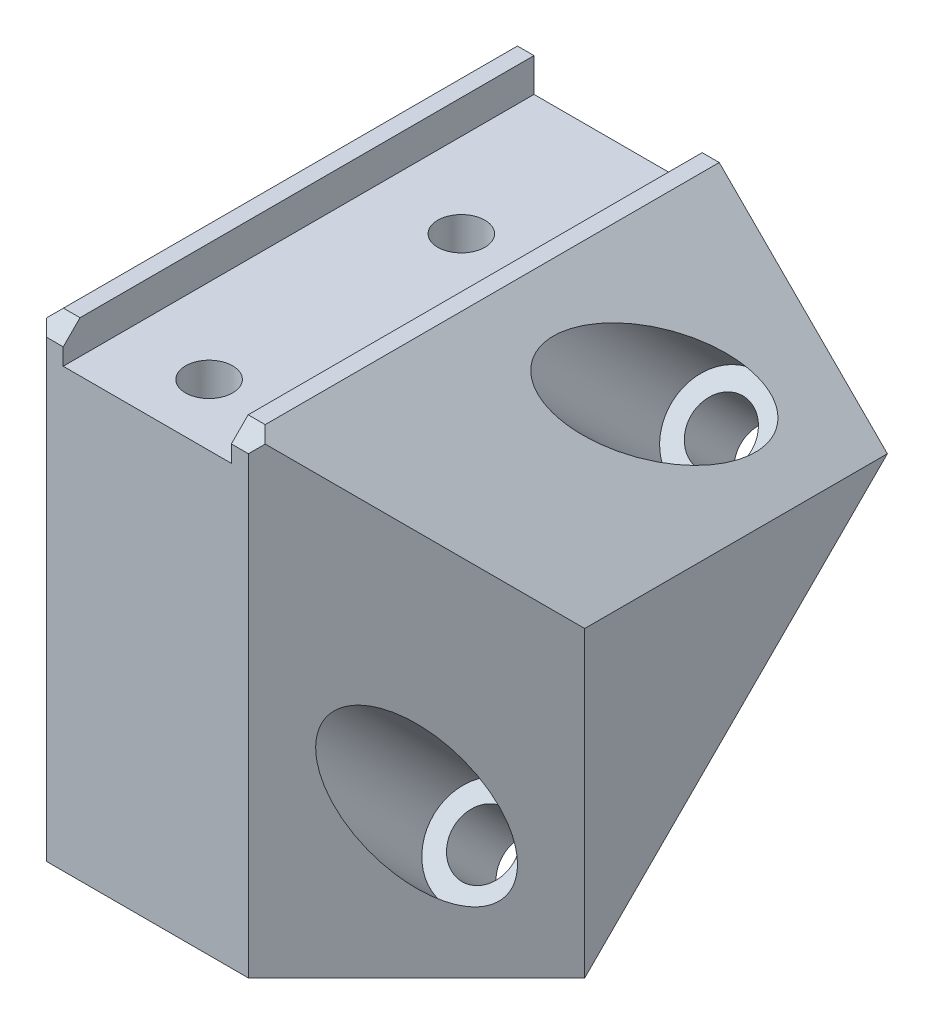
ISO-10303-21;
HEADER;
FILE_DESCRIPTION(('STEP AP214'),'2;1');
FILE_NAME('part.step','',(''),(''),'','','');
FILE_SCHEMA(('AUTOMOTIVE_DESIGN { 1 0 10303 214 1 1 1 1 }'));
ENDSEC;
DATA;
#1=APPLICATION_CONTEXT('core data for automotive mechanical design processes');
#2=APPLICATION_PROTOCOL_DEFINITION('international standard','automotive_design',2000,#1);
#3=PRODUCT_CONTEXT('',#1,'mechanical');
#4=PRODUCT('Part','Part','',(#3));
#5=PRODUCT_RELATED_PRODUCT_CATEGORY('part','',(#4));
#6=PRODUCT_DEFINITION_FORMATION('','',#4);
#7=PRODUCT_DEFINITION_CONTEXT('part definition',#1,'design');
#8=PRODUCT_DEFINITION('design','',#6,#7);
#9=PRODUCT_DEFINITION_SHAPE('','',#8);
#10=(LENGTH_UNIT() NAMED_UNIT(*) SI_UNIT(.MILLI.,.METRE.));
#11=(NAMED_UNIT(*) PLANE_ANGLE_UNIT() SI_UNIT($,.RADIAN.));
#12=(NAMED_UNIT(*) SI_UNIT($,.STERADIAN.) SOLID_ANGLE_UNIT());
#13=UNCERTAINTY_MEASURE_WITH_UNIT(LENGTH_MEASURE(1.E-05),#10,'distance_accuracy_value','');
#14=(GEOMETRIC_REPRESENTATION_CONTEXT(3) GLOBAL_UNCERTAINTY_ASSIGNED_CONTEXT((#13)) GLOBAL_UNIT_ASSIGNED_CONTEXT((#10,
#11,#12)) REPRESENTATION_CONTEXT('',''));
#15=CARTESIAN_POINT('',(0.,0.,0.));
#16=DIRECTION('',(0.,0.,1.));
#17=DIRECTION('',(1.,0.,0.));
#18=AXIS2_PLACEMENT_3D('',#15,#16,#17);
#19=CARTESIAN_POINT('',(32.,0.,0.));
#20=DIRECTION('',(0.,0.,1.));
#21=DIRECTION('',(0.,-1.,0.));
#22=AXIS2_PLACEMENT_3D('',#19,#20,#21);
#23=PLANE('',#22);
#24=DIRECTION('',(0.,1.,0.));
#25=VECTOR('',#24,1.);
#26=CARTESIAN_POINT('',(20.986268973915,26.,0.));
#27=LINE('',#26,#25);
#28=CARTESIAN_POINT('',(20.986268973915,26.,0.));
#29=VERTEX_POINT('',#28);
#30=CARTESIAN_POINT('',(20.986268973915,28.,0.));
#31=VERTEX_POINT('',#30);
#32=EDGE_CURVE('E151',#29,#31,#27,.T.);
#33=ORIENTED_EDGE('',*,*,#32,.T.);
#34=DIRECTION('',(-1.,0.,0.));
#35=VECTOR('',#34,1.);
#36=CARTESIAN_POINT('',(32.,28.,0.));
#37=LINE('',#36,#35);
#38=CARTESIAN_POINT('',(22.,28.,0.));
#39=VERTEX_POINT('',#38);
#40=EDGE_CURVE('E216',#39,#31,#37,.T.);
#41=ORIENTED_EDGE('',*,*,#40,.F.);
#42=DIRECTION('',(0.707106781186549,-0.707106781186546,0.));
#43=VECTOR('',#42,1.);
#44=CARTESIAN_POINT('',(32.,18.,0.));
#45=LINE('',#44,#43);
#46=CARTESIAN_POINT('',(32.,18.,0.));
#47=VERTEX_POINT('',#46);
#48=EDGE_CURVE('E268',#39,#47,#45,.T.);
#49=ORIENTED_EDGE('',*,*,#48,.T.);
#50=DIRECTION('',(-1.,0.,0.));
#51=VECTOR('',#50,1.);
#52=CARTESIAN_POINT('',(32.,18.,0.));
#53=LINE('',#52,#51);
#54=CARTESIAN_POINT('',(0.,18.,0.));
#55=VERTEX_POINT('',#54);
#56=EDGE_CURVE('E218',#47,#55,#53,.T.);
#57=ORIENTED_EDGE('',*,*,#56,.T.);
#58=DIRECTION('',(-0.707106781186546,-0.707106781186549,0.));
#59=VECTOR('',#58,1.);
#60=CARTESIAN_POINT('',(10.,28.,0.));
#61=LINE('',#60,#59);
#62=CARTESIAN_POINT('',(10.,28.,0.));
#63=VERTEX_POINT('',#62);
#64=EDGE_CURVE('E270',#55,#63,#61,.F.);
#65=ORIENTED_EDGE('',*,*,#64,.T.);
#66=CARTESIAN_POINT('',(10.986268973915,28.,0.));
#67=VERTEX_POINT('',#66);
#68=EDGE_CURVE('E215',#67,#63,#37,.T.);
#69=ORIENTED_EDGE('',*,*,#68,.F.);
#70=DIRECTION('',(0.,1.,0.));
#71=VECTOR('',#70,1.);
#72=CARTESIAN_POINT('',(10.986268973915,26.,0.));
#73=LINE('',#72,#71);
#74=CARTESIAN_POINT('',(10.986268973915,26.,0.));
#75=VERTEX_POINT('',#74);
#76=EDGE_CURVE('E162',#75,#67,#73,.T.);
#77=ORIENTED_EDGE('',*,*,#76,.F.);
#78=DIRECTION('',(1.,0.,0.));
#79=VECTOR('',#78,1.);
#80=CARTESIAN_POINT('',(10.986268973915,26.,0.));
#81=LINE('',#80,#79);
#82=EDGE_CURVE('E143',#75,#29,#81,.T.);
#83=ORIENTED_EDGE('',*,*,#82,.T.);
#84=EDGE_LOOP('',(#33,#41,#49,#57,#65,#69,#77,#83));
#85=FACE_BOUND('',#84,.T.);
#86=ADVANCED_FACE('F39',(#85),#23,.F.);
#87=CARTESIAN_POINT('',(32.,28.,0.));
#88=DIRECTION('',(0.,-1.,0.));
#89=DIRECTION('',(0.,0.,-1.));
#90=AXIS2_PLACEMENT_3D('',#87,#88,#89);
#91=PLANE('',#90);
#92=DIRECTION('',(0.,0.,1.));
#93=VECTOR('',#92,1.);
#94=CARTESIAN_POINT('',(20.986268973915,28.,0.));
#95=LINE('',#94,#93);
#96=CARTESIAN_POINT('',(20.986268973915,28.,27.));
#97=VERTEX_POINT('',#96);
#98=EDGE_CURVE('E154',#31,#97,#95,.T.);
#99=ORIENTED_EDGE('',*,*,#98,.T.);
#100=DIRECTION('',(1.,0.,0.));
#101=VECTOR('',#100,1.);
#102=CARTESIAN_POINT('',(32.,28.,27.));
#103=LINE('',#102,#101);
#104=CARTESIAN_POINT('',(22.,28.,27.));
#105=VERTEX_POINT('',#104);
#106=EDGE_CURVE('E233',#97,#105,#103,.T.);
#107=ORIENTED_EDGE('',*,*,#106,.T.);
#108=DIRECTION('',(0.,0.,-1.));
#109=VECTOR('',#108,1.);
#110=CARTESIAN_POINT('',(22.,28.,0.));
#111=LINE('',#110,#109);
#112=EDGE_CURVE('E237',#105,#39,#111,.T.);
#113=ORIENTED_EDGE('',*,*,#112,.T.);
#114=ORIENTED_EDGE('',*,*,#40,.T.);
#115=EDGE_LOOP('',(#99,#107,#113,#114));
#116=FACE_BOUND('',#115,.T.);
#117=ADVANCED_FACE('F340',(#116),#91,.F.);
#118=CARTESIAN_POINT('',(32.,0.,28.));
#119=DIRECTION('',(0.,0.,-1.));
#120=DIRECTION('',(-1.,0.,0.));
#121=AXIS2_PLACEMENT_3D('',#118,#119,#120);
#122=PLANE('',#121);
#123=DIRECTION('',(0.,1.,0.));
#124=VECTOR('',#123,1.);
#125=CARTESIAN_POINT('',(20.986268973915,26.,28.));
#126=LINE('',#125,#124);
#127=CARTESIAN_POINT('',(20.986268973915,26.,28.));
#128=VERTEX_POINT('',#127);
#129=CARTESIAN_POINT('',(20.986268973915,27.,28.));
#130=VERTEX_POINT('',#129);
#131=EDGE_CURVE('E158',#128,#130,#126,.T.);
#132=ORIENTED_EDGE('',*,*,#131,.F.);
#133=DIRECTION('',(1.,0.,0.));
#134=VECTOR('',#133,1.);
#135=CARTESIAN_POINT('',(10.986268973915,26.,28.));
#136=LINE('',#135,#134);
#137=CARTESIAN_POINT('',(10.986268973915,26.,28.));
#138=VERTEX_POINT('',#137);
#139=EDGE_CURVE('E146',#138,#128,#136,.T.);
#140=ORIENTED_EDGE('',*,*,#139,.F.);
#141=DIRECTION('',(0.,1.,0.));
#142=VECTOR('',#141,1.);
#143=CARTESIAN_POINT('',(10.986268973915,26.,28.));
#144=LINE('',#143,#142);
#145=CARTESIAN_POINT('',(10.986268973915,27.,28.));
#146=VERTEX_POINT('',#145);
#147=EDGE_CURVE('E171',#138,#146,#144,.T.);
#148=ORIENTED_EDGE('',*,*,#147,.T.);
#149=DIRECTION('',(-1.,0.,0.));
#150=VECTOR('',#149,1.);
#151=CARTESIAN_POINT('',(32.,27.,28.));
#152=LINE('',#151,#150);
#153=CARTESIAN_POINT('',(10.,27.,28.));
#154=VERTEX_POINT('',#153);
#155=EDGE_CURVE('E229',#146,#154,#152,.T.);
#156=ORIENTED_EDGE('',*,*,#155,.T.);
#157=DIRECTION('',(0.,-1.,0.));
#158=VECTOR('',#157,1.);
#159=CARTESIAN_POINT('',(10.,0.,28.));
#160=LINE('',#159,#158);
#161=CARTESIAN_POINT('',(10.,0.,28.));
#162=VERTEX_POINT('',#161);
#163=EDGE_CURVE('E275',#154,#162,#160,.T.);
#164=ORIENTED_EDGE('',*,*,#163,.T.);
#165=DIRECTION('',(-1.,0.,0.));
#166=VECTOR('',#165,1.);
#167=CARTESIAN_POINT('',(32.,0.,28.));
#168=LINE('',#167,#166);
#169=CARTESIAN_POINT('',(22.,0.,28.));
#170=VERTEX_POINT('',#169);
#171=EDGE_CURVE('E210',#170,#162,#168,.T.);
#172=ORIENTED_EDGE('',*,*,#171,.F.);
#173=DIRECTION('',(0.,1.,0.));
#174=VECTOR('',#173,1.);
#175=CARTESIAN_POINT('',(22.,27.,28.));
#176=LINE('',#175,#174);
#177=CARTESIAN_POINT('',(22.,27.,28.));
#178=VERTEX_POINT('',#177);
#179=EDGE_CURVE('E273',#170,#178,#176,.T.);
#180=ORIENTED_EDGE('',*,*,#179,.T.);
#181=EDGE_CURVE('E230',#178,#130,#152,.T.);
#182=ORIENTED_EDGE('',*,*,#181,.T.);
#183=EDGE_LOOP('',(#132,#140,#148,#156,#164,#172,#180,#182));
#184=FACE_BOUND('',#183,.T.);
#185=ADVANCED_FACE('F303',(#184),#122,.F.);
#186=CARTESIAN_POINT('',(32.,27.,28.));
#187=DIRECTION('',(0.,-0.707106781186547,-0.707106781186547));
#188=DIRECTION('',(-1.,0.,0.));
#189=AXIS2_PLACEMENT_3D('',#186,#187,#188);
#190=PLANE('',#189);
#191=ORIENTED_EDGE('',*,*,#106,.F.);
#192=DIRECTION('',(0.,0.707106781186548,-0.707106781186548));
#193=VECTOR('',#192,1.);
#194=CARTESIAN_POINT('',(20.986268973915,27.,28.));
#195=LINE('',#194,#193);
#196=EDGE_CURVE('E11',#97,#130,#195,.F.);
#197=ORIENTED_EDGE('',*,*,#196,.T.);
#198=ORIENTED_EDGE('',*,*,#181,.F.);
#199=DIRECTION('',(-0.577350269189627,-0.577350269189625,0.577350269189625));
#200=VECTOR('',#199,1.);
#201=CARTESIAN_POINT('',(25.3333333333333,30.3333333333333,24.6666666666667));
#202=LINE('',#201,#200);
#203=CARTESIAN_POINT('',(22.5,27.5,27.5));
#204=VERTEX_POINT('',#203);
#205=EDGE_CURVE('E257',#178,#204,#202,.F.);
#206=ORIENTED_EDGE('',*,*,#205,.T.);
#207=DIRECTION('',(0.577350269189627,-0.577350269189625,0.577350269189625));
#208=VECTOR('',#207,1.);
#209=CARTESIAN_POINT('',(26.,24.,31.));
#210=LINE('',#209,#208);
#211=EDGE_CURVE('E254',#204,#105,#210,.F.);
#212=ORIENTED_EDGE('',*,*,#211,.T.);
#213=EDGE_LOOP('',(#191,#197,#198,#206,#212));
#214=FACE_BOUND('',#213,.T.);
#215=ADVANCED_FACE('F338',(#214),#190,.F.);
#216=CARTESIAN_POINT('',(5.,20.9289321881346,35.0710678118654));
#217=DIRECTION('',(0.,-0.707106781186549,-0.707106781186546));
#218=DIRECTION('',(0.,0.707106781186546,-0.707106781186549));
#219=AXIS2_PLACEMENT_3D('',#216,#217,#218);
#220=CYLINDRICAL_SURFACE('',#219,1.8);
#221=CARTESIAN_POINT('',(5.,1.92893218813456,16.0710678118655));
#222=DIRECTION('',(0.,-0.707106781186549,-0.707106781186546));
#223=DIRECTION('',(0.,0.707106781186546,-0.707106781186549));
#224=AXIS2_PLACEMENT_3D('',#221,#222,#223);
#225=CIRCLE('',#224,1.8);
#226=CARTESIAN_POINT('',(5.,3.20172439427035,14.7982756057297));
#227=VERTEX_POINT('',#226);
#228=EDGE_CURVE('E200',#227,#227,#225,.T.);
#229=ORIENTED_EDGE('',*,*,#228,.T.);
#230=EDGE_LOOP('',(#229));
#231=FACE_BOUND('',#230,.T.);
#232=CARTESIAN_POINT('',(5.,4.8725830020305,19.0147186257614));
#233=DIRECTION('',(0.,0.707106781186548,0.707106781186547));
#234=DIRECTION('',(0.,-0.707106781186547,0.707106781186548));
#235=AXIS2_PLACEMENT_3D('',#232,#233,#234);
#236=CIRCLE('',#235,1.8);
#237=CARTESIAN_POINT('',(5.,3.59979079589472,20.2875108318972));
#238=VERTEX_POINT('',#237);
#239=EDGE_CURVE('E246',#238,#238,#236,.F.);
#240=ORIENTED_EDGE('',*,*,#239,.F.);
#241=EDGE_LOOP('',(#240));
#242=FACE_BOUND('',#241,.T.);
#243=ADVANCED_FACE('F394',(#231,#242),#220,.F.);
#244=CARTESIAN_POINT('',(27.,35.0710678118655,20.9289321881345));
#245=DIRECTION('',(0.,-0.707106781186549,-0.707106781186546));
#246=DIRECTION('',(0.,0.707106781186546,-0.707106781186549));
#247=AXIS2_PLACEMENT_3D('',#244,#245,#246);
#248=CYLINDRICAL_SURFACE('',#247,1.8);
#249=CARTESIAN_POINT('',(27.,16.0710678118655,1.92893218813451));
#250=DIRECTION('',(0.,-0.707106781186549,-0.707106781186546));
#251=DIRECTION('',(0.,0.707106781186546,-0.707106781186549));
#252=AXIS2_PLACEMENT_3D('',#249,#250,#251);
#253=CIRCLE('',#252,1.8);
#254=CARTESIAN_POINT('',(27.,17.3438600180013,0.656139981998726));
#255=VERTEX_POINT('',#254);
#256=EDGE_CURVE('E193',#255,#255,#253,.T.);
#257=ORIENTED_EDGE('',*,*,#256,.T.);
#258=EDGE_LOOP('',(#257));
#259=FACE_BOUND('',#258,.T.);
#260=CARTESIAN_POINT('',(27.,19.0147186257615,4.87258300203047));
#261=DIRECTION('',(0.,0.707106781186548,0.707106781186547));
#262=DIRECTION('',(0.,-0.707106781186547,0.707106781186548));
#263=AXIS2_PLACEMENT_3D('',#260,#261,#262);
#264=CIRCLE('',#263,1.8);
#265=CARTESIAN_POINT('',(27.,17.7419264196257,6.14537520816625));
#266=VERTEX_POINT('',#265);
#267=EDGE_CURVE('E243',#266,#266,#264,.F.);
#268=ORIENTED_EDGE('',*,*,#267,.F.);
#269=EDGE_LOOP('',(#268));
#270=FACE_BOUND('',#269,.T.);
#271=ADVANCED_FACE('F396',(#259,#270),#248,.F.);
#272=CARTESIAN_POINT('',(27.,20.9289321881346,35.0710678118654));
#273=DIRECTION('',(0.,-0.707106781186549,-0.707106781186546));
#274=DIRECTION('',(0.,0.707106781186546,-0.707106781186549));
#275=AXIS2_PLACEMENT_3D('',#272,#273,#274);
#276=CYLINDRICAL_SURFACE('',#275,1.8);
#277=CARTESIAN_POINT('',(27.,1.92893218813456,16.0710678118655));
#278=DIRECTION('',(0.,-0.707106781186549,-0.707106781186546));
#279=DIRECTION('',(0.,0.707106781186546,-0.707106781186549));
#280=AXIS2_PLACEMENT_3D('',#277,#278,#279);
#281=CIRCLE('',#280,1.8);
#282=CARTESIAN_POINT('',(27.,3.20172439427035,14.7982756057297));
#283=VERTEX_POINT('',#282);
#284=EDGE_CURVE('E196',#283,#283,#281,.T.);
#285=ORIENTED_EDGE('',*,*,#284,.T.);
#286=EDGE_LOOP('',(#285));
#287=FACE_BOUND('',#286,.T.);
#288=CARTESIAN_POINT('',(27.,4.8725830020305,19.0147186257614));
#289=DIRECTION('',(0.,0.707106781186548,0.707106781186547));
#290=DIRECTION('',(0.,-0.707106781186547,0.707106781186548));
#291=AXIS2_PLACEMENT_3D('',#288,#289,#290);
#292=CIRCLE('',#291,1.8);
#293=CARTESIAN_POINT('',(27.,3.59979079589472,20.2875108318972));
#294=VERTEX_POINT('',#293);
#295=EDGE_CURVE('E240',#294,#294,#292,.F.);
#296=ORIENTED_EDGE('',*,*,#295,.F.);
#297=EDGE_LOOP('',(#296));
#298=FACE_BOUND('',#297,.T.);
#299=ADVANCED_FACE('F358',(#287,#298),#276,.F.);
#300=CARTESIAN_POINT('',(5.,35.0710678118655,20.9289321881345));
#301=DIRECTION('',(0.,-0.707106781186549,-0.707106781186546));
#302=DIRECTION('',(0.,0.707106781186546,-0.707106781186549));
#303=AXIS2_PLACEMENT_3D('',#300,#301,#302);
#304=CYLINDRICAL_SURFACE('',#303,1.8);
#305=CARTESIAN_POINT('',(5.,16.0710678118655,1.92893218813451));
#306=DIRECTION('',(0.,-0.707106781186549,-0.707106781186546));
#307=DIRECTION('',(0.,0.707106781186546,-0.707106781186549));
#308=AXIS2_PLACEMENT_3D('',#305,#306,#307);
#309=CIRCLE('',#308,1.8);
#310=CARTESIAN_POINT('',(5.,17.3438600180013,0.656139981998728));
#311=VERTEX_POINT('',#310);
#312=EDGE_CURVE('E197',#311,#311,#309,.T.);
#313=ORIENTED_EDGE('',*,*,#312,.T.);
#314=EDGE_LOOP('',(#313));
#315=FACE_BOUND('',#314,.T.);
#316=CARTESIAN_POINT('',(5.,19.0147186257615,4.87258300203047));
#317=DIRECTION('',(0.,0.707106781186548,0.707106781186547));
#318=DIRECTION('',(0.,-0.707106781186547,0.707106781186548));
#319=AXIS2_PLACEMENT_3D('',#316,#317,#318);
#320=CIRCLE('',#319,1.8);
#321=CARTESIAN_POINT('',(5.,17.7419264196257,6.14537520816625));
#322=VERTEX_POINT('',#321);
#323=EDGE_CURVE('E192',#322,#322,#320,.F.);
#324=ORIENTED_EDGE('',*,*,#323,.F.);
#325=EDGE_LOOP('',(#324));
#326=FACE_BOUND('',#325,.T.);
#327=ADVANCED_FACE('F351',(#315,#326),#304,.F.);
#328=CARTESIAN_POINT('',(10.,28.,27.));
#329=VERTEX_POINT('',#328);
#330=CARTESIAN_POINT('',(10.986268973915,28.,27.));
#331=VERTEX_POINT('',#330);
#332=EDGE_CURVE('E234',#329,#331,#103,.T.);
#333=ORIENTED_EDGE('',*,*,#332,.T.);
#334=DIRECTION('',(0.,0.,1.));
#335=VECTOR('',#334,1.);
#336=CARTESIAN_POINT('',(10.986268973915,28.,0.));
#337=LINE('',#336,#335);
#338=EDGE_CURVE('E56',#67,#331,#337,.T.);
#339=ORIENTED_EDGE('',*,*,#338,.F.);
#340=ORIENTED_EDGE('',*,*,#68,.T.);
#341=DIRECTION('',(0.,0.,1.));
#342=VECTOR('',#341,1.);
#343=CARTESIAN_POINT('',(10.,28.,0.));
#344=LINE('',#343,#342);
#345=EDGE_CURVE('E251',#63,#329,#344,.T.);
#346=ORIENTED_EDGE('',*,*,#345,.T.);
#347=EDGE_LOOP('',(#333,#339,#340,#346));
#348=FACE_BOUND('',#347,.T.);
#349=ADVANCED_FACE('F343',(#348),#91,.F.);
#350=CARTESIAN_POINT('',(32.,0.,0.));
#351=DIRECTION('',(0.,1.,0.));
#352=DIRECTION('',(0.,0.,1.));
#353=AXIS2_PLACEMENT_3D('',#350,#351,#352);
#354=PLANE('',#353);
#355=ORIENTED_EDGE('',*,*,#171,.T.);
#356=DIRECTION('',(0.707106781186546,0.,0.707106781186549));
#357=VECTOR('',#356,1.);
#358=CARTESIAN_POINT('',(10.,0.,28.));
#359=LINE('',#358,#357);
#360=CARTESIAN_POINT('',(0.,0.,18.0000000000001));
#361=VERTEX_POINT('',#360);
#362=EDGE_CURVE('E279',#162,#361,#359,.F.);
#363=ORIENTED_EDGE('',*,*,#362,.T.);
#364=DIRECTION('',(1.,0.,0.));
#365=VECTOR('',#364,1.);
#366=CARTESIAN_POINT('',(32.,0.,18.0000000000001));
#367=LINE('',#366,#365);
#368=CARTESIAN_POINT('',(32.,0.,18.0000000000001));
#369=VERTEX_POINT('',#368);
#370=EDGE_CURVE('E224',#361,#369,#367,.T.);
#371=ORIENTED_EDGE('',*,*,#370,.T.);
#372=DIRECTION('',(-0.707106781186549,0.,0.707106781186546));
#373=VECTOR('',#372,1.);
#374=CARTESIAN_POINT('',(32.,0.,18.));
#375=LINE('',#374,#373);
#376=EDGE_CURVE('E277',#369,#170,#375,.T.);
#377=ORIENTED_EDGE('',*,*,#376,.T.);
#378=EDGE_LOOP('',(#355,#363,#371,#377));
#379=FACE_BOUND('',#378,.T.);
#380=ADVANCED_FACE('F316',(#379),#354,.F.);
#381=CARTESIAN_POINT('',(32.,0.,0.));
#382=DIRECTION('',(1.,0.,0.));
#383=DIRECTION('',(0.,0.,-1.));
#384=AXIS2_PLACEMENT_3D('',#381,#382,#383);
#385=PLANE('',#384);
#386=DIRECTION('',(0.,0.,1.));
#387=VECTOR('',#386,1.);
#388=CARTESIAN_POINT('',(32.,18.,27.));
#389=LINE('',#388,#387);
#390=CARTESIAN_POINT('',(32.,18.,18.));
#391=VERTEX_POINT('',#390);
#392=EDGE_CURVE('E64',#47,#391,#389,.T.);
#393=ORIENTED_EDGE('',*,*,#392,.T.);
#394=DIRECTION('',(0.,-1.,0.));
#395=VECTOR('',#394,1.);
#396=CARTESIAN_POINT('',(32.,0.,18.));
#397=LINE('',#396,#395);
#398=EDGE_CURVE('E282',#391,#369,#397,.T.);
#399=ORIENTED_EDGE('',*,*,#398,.T.);
#400=DIRECTION('',(0.,-0.707106781186546,0.707106781186549));
#401=VECTOR('',#400,1.);
#402=CARTESIAN_POINT('',(32.,9.00000000000003,9.));
#403=LINE('',#402,#401);
#404=EDGE_CURVE('E227',#369,#47,#403,.F.);
#405=ORIENTED_EDGE('',*,*,#404,.T.);
#406=EDGE_LOOP('',(#393,#399,#405));
#407=FACE_BOUND('',#406,.T.);
#408=ADVANCED_FACE('F324',(#407),#385,.T.);
#409=CARTESIAN_POINT('',(0.,0.,0.));
#410=DIRECTION('',(1.,0.,0.));
#411=DIRECTION('',(0.,0.,-1.));
#412=AXIS2_PLACEMENT_3D('',#409,#410,#411);
#413=PLANE('',#412);
#414=DIRECTION('',(0.,1.,0.));
#415=VECTOR('',#414,1.);
#416=CARTESIAN_POINT('',(0.,0.,18.));
#417=LINE('',#416,#415);
#418=CARTESIAN_POINT('',(0.,18.,18.));
#419=VERTEX_POINT('',#418);
#420=EDGE_CURVE('E264',#361,#419,#417,.T.);
#421=ORIENTED_EDGE('',*,*,#420,.T.);
#422=DIRECTION('',(0.,0.,-1.));
#423=VECTOR('',#422,1.);
#424=CARTESIAN_POINT('',(0.,18.,0.));
#425=LINE('',#424,#423);
#426=EDGE_CURVE('E266',#419,#55,#425,.T.);
#427=ORIENTED_EDGE('',*,*,#426,.T.);
#428=DIRECTION('',(0.,0.707106781186546,-0.707106781186549));
#429=VECTOR('',#428,1.);
#430=CARTESIAN_POINT('',(0.,18.,0.));
#431=LINE('',#430,#429);
#432=EDGE_CURVE('E221',#55,#361,#431,.F.);
#433=ORIENTED_EDGE('',*,*,#432,.T.);
#434=EDGE_LOOP('',(#421,#427,#433));
#435=FACE_BOUND('',#434,.T.);
#436=ADVANCED_FACE('F367',(#435),#413,.F.);
#437=CARTESIAN_POINT('',(32.,18.,0.));
#438=DIRECTION('',(0.,0.707106781186549,0.707106781186546));
#439=DIRECTION('',(-1.,0.,0.));
#440=AXIS2_PLACEMENT_3D('',#437,#438,#439);
#441=PLANE('',#440);
#442=ORIENTED_EDGE('',*,*,#312,.F.);
#443=EDGE_LOOP('',(#442));
#444=FACE_BOUND('',#443,.T.);
#445=ORIENTED_EDGE('',*,*,#284,.F.);
#446=EDGE_LOOP('',(#445));
#447=FACE_BOUND('',#446,.T.);
#448=ORIENTED_EDGE('',*,*,#256,.F.);
#449=EDGE_LOOP('',(#448));
#450=FACE_BOUND('',#449,.T.);
#451=ORIENTED_EDGE('',*,*,#228,.F.);
#452=EDGE_LOOP('',(#451));
#453=FACE_BOUND('',#452,.T.);
#454=ORIENTED_EDGE('',*,*,#404,.F.);
#455=ORIENTED_EDGE('',*,*,#370,.F.);
#456=ORIENTED_EDGE('',*,*,#432,.F.);
#457=ORIENTED_EDGE('',*,*,#56,.F.);
#458=EDGE_LOOP('',(#454,#455,#456,#457));
#459=FACE_BOUND('',#458,.T.);
#460=ADVANCED_FACE('F328',(#444,#447,#450,#453,#459),#441,.F.);
#461=DIRECTION('',(0.,0.707106781186548,-0.707106781186548));
#462=VECTOR('',#461,1.);
#463=CARTESIAN_POINT('',(10.986268973915,27.,28.));
#464=LINE('',#463,#462);
#465=EDGE_CURVE('E49',#331,#146,#464,.F.);
#466=ORIENTED_EDGE('',*,*,#465,.F.);
#467=ORIENTED_EDGE('',*,*,#332,.F.);
#468=DIRECTION('',(-0.577350269189625,-0.577350269189626,0.577350269189626));
#469=VECTOR('',#468,1.);
#470=CARTESIAN_POINT('',(16.6666666666666,34.6666666666667,20.3333333333333));
#471=LINE('',#470,#469);
#472=CARTESIAN_POINT('',(9.50000000000001,27.5,27.5));
#473=VERTEX_POINT('',#472);
#474=EDGE_CURVE('E262',#329,#473,#471,.T.);
#475=ORIENTED_EDGE('',*,*,#474,.T.);
#476=DIRECTION('',(0.577350269189624,-0.577350269189626,0.577350269189626));
#477=VECTOR('',#476,1.);
#478=CARTESIAN_POINT('',(17.3333333333333,19.6666666666667,35.3333333333333));
#479=LINE('',#478,#477);
#480=EDGE_CURVE('E259',#473,#154,#479,.T.);
#481=ORIENTED_EDGE('',*,*,#480,.T.);
#482=ORIENTED_EDGE('',*,*,#155,.F.);
#483=EDGE_LOOP('',(#466,#467,#475,#481,#482));
#484=FACE_BOUND('',#483,.T.);
#485=ADVANCED_FACE('F304',(#484),#190,.F.);
#486=CARTESIAN_POINT('',(5.,19.0147186257615,4.87258300203045));
#487=DIRECTION('',(0.,0.707106781186548,0.707106781186547));
#488=DIRECTION('',(0.,-0.707106781186547,0.707106781186548));
#489=AXIS2_PLACEMENT_3D('',#486,#487,#488);
#490=CYLINDRICAL_SURFACE('',#489,3.);
#491=CARTESIAN_POINT('',(5.,19.0147186257615,4.87258300203045));
#492=DIRECTION('',(0.,0.707106781186548,0.707106781186547));
#493=DIRECTION('',(0.,-0.707106781186547,0.707106781186548));
#494=AXIS2_PLACEMENT_3D('',#491,#492,#493);
#495=CIRCLE('',#494,3.);
#496=CARTESIAN_POINT('',(5.,16.8933982822018,6.9939033455901));
#497=VERTEX_POINT('',#496);
#498=EDGE_CURVE('E186',#497,#497,#495,.T.);
#499=ORIENTED_EDGE('',*,*,#498,.F.);
#500=EDGE_LOOP('',(#499));
#501=FACE_BOUND('',#500,.T.);
#502=CARTESIAN_POINT('',(5.,23.,8.85786437626897));
#503=DIRECTION('',(0.707106781186549,-0.707106781186546,0.));
#504=DIRECTION('',(0.408248290463863,0.408248290463864,0.816496580927726));
#505=AXIS2_PLACEMENT_3D('',#502,#503,#504);
#506=ELLIPSE('',#505,6.00000000000001,3.);
#507=CARTESIAN_POINT('',(7.44948974278319,25.4494897427832,13.7568438618353));
#508=VERTEX_POINT('',#507);
#509=EDGE_CURVE('E288',#508,#508,#506,.T.);
#510=ORIENTED_EDGE('',*,*,#509,.F.);
#511=EDGE_LOOP('',(#510));
#512=FACE_BOUND('',#511,.T.);
#513=ADVANCED_FACE('F405',(#501,#512),#490,.F.);
#514=CARTESIAN_POINT('',(5.,19.0147186257615,4.87258300203045));
#515=DIRECTION('',(0.,0.707106781186548,0.707106781186547));
#516=DIRECTION('',(0.,-0.707106781186547,0.707106781186548));
#517=AXIS2_PLACEMENT_3D('',#514,#515,#516);
#518=PLANE('',#517);
#519=ORIENTED_EDGE('',*,*,#498,.T.);
#520=EDGE_LOOP('',(#519));
#521=FACE_BOUND('',#520,.T.);
#522=ORIENTED_EDGE('',*,*,#323,.T.);
#523=EDGE_LOOP('',(#522));
#524=FACE_BOUND('',#523,.T.);
#525=ADVANCED_FACE('F408',(#521,#524),#518,.T.);
#526=CARTESIAN_POINT('',(27.,4.87258300203052,19.0147186257614));
#527=DIRECTION('',(0.,0.707106781186548,0.707106781186547));
#528=DIRECTION('',(0.,-0.707106781186547,0.707106781186548));
#529=AXIS2_PLACEMENT_3D('',#526,#527,#528);
#530=CYLINDRICAL_SURFACE('',#529,3.);
#531=CARTESIAN_POINT('',(27.,4.87258300203052,19.0147186257614));
#532=DIRECTION('',(0.,0.707106781186548,0.707106781186547));
#533=DIRECTION('',(0.,-0.707106781186547,0.707106781186548));
#534=AXIS2_PLACEMENT_3D('',#531,#532,#533);
#535=CIRCLE('',#534,3.);
#536=CARTESIAN_POINT('',(27.,2.75126265847087,21.1360389693211));
#537=VERTEX_POINT('',#536);
#538=EDGE_CURVE('E179',#537,#537,#535,.T.);
#539=ORIENTED_EDGE('',*,*,#538,.F.);
#540=EDGE_LOOP('',(#539));
#541=FACE_BOUND('',#540,.T.);
#542=CARTESIAN_POINT('',(27.,8.85786437626908,23.));
#543=DIRECTION('',(0.707106781186546,0.,0.707106781186549));
#544=DIRECTION('',(-0.408248290463863,0.816496580927727,0.408248290463862));
#545=AXIS2_PLACEMENT_3D('',#542,#543,#544);
#546=ELLIPSE('',#545,5.99999999999999,3.);
#547=CARTESIAN_POINT('',(24.5505102572168,13.7568438618354,25.4494897427831));
#548=VERTEX_POINT('',#547);
#549=EDGE_CURVE('E249',#548,#548,#546,.F.);
#550=ORIENTED_EDGE('',*,*,#549,.F.);
#551=EDGE_LOOP('',(#550));
#552=FACE_BOUND('',#551,.T.);
#553=ADVANCED_FACE('F412',(#541,#552),#530,.F.);
#554=CARTESIAN_POINT('',(27.,4.87258300203052,19.0147186257614));
#555=DIRECTION('',(0.,0.707106781186548,0.707106781186547));
#556=DIRECTION('',(0.,-0.707106781186547,0.707106781186548));
#557=AXIS2_PLACEMENT_3D('',#554,#555,#556);
#558=PLANE('',#557);
#559=ORIENTED_EDGE('',*,*,#538,.T.);
#560=EDGE_LOOP('',(#559));
#561=FACE_BOUND('',#560,.T.);
#562=ORIENTED_EDGE('',*,*,#295,.T.);
#563=EDGE_LOOP('',(#562));
#564=FACE_BOUND('',#563,.T.);
#565=ADVANCED_FACE('F429',(#561,#564),#558,.T.);
#566=CARTESIAN_POINT('',(27.,19.0147186257615,4.87258300203045));
#567=DIRECTION('',(0.,0.707106781186548,0.707106781186547));
#568=DIRECTION('',(0.,-0.707106781186547,0.707106781186548));
#569=AXIS2_PLACEMENT_3D('',#566,#567,#568);
#570=CYLINDRICAL_SURFACE('',#569,3.);
#571=CARTESIAN_POINT('',(27.,19.0147186257615,4.87258300203045));
#572=DIRECTION('',(0.,0.707106781186548,0.707106781186547));
#573=DIRECTION('',(0.,-0.707106781186547,0.707106781186548));
#574=AXIS2_PLACEMENT_3D('',#571,#572,#573);
#575=CIRCLE('',#574,3.);
#576=CARTESIAN_POINT('',(27.,16.8933982822018,6.9939033455901));
#577=VERTEX_POINT('',#576);
#578=EDGE_CURVE('E182',#577,#577,#575,.T.);
#579=ORIENTED_EDGE('',*,*,#578,.F.);
#580=EDGE_LOOP('',(#579));
#581=FACE_BOUND('',#580,.T.);
#582=CARTESIAN_POINT('',(27.,23.,8.85786437626896));
#583=DIRECTION('',(0.707106781186546,0.707106781186549,0.));
#584=DIRECTION('',(-0.408248290463864,0.408248290463862,0.816496580927727));
#585=AXIS2_PLACEMENT_3D('',#582,#583,#584);
#586=ELLIPSE('',#585,5.99999999999999,3.);
#587=CARTESIAN_POINT('',(24.5505102572168,25.4494897427831,13.7568438618353));
#588=VERTEX_POINT('',#587);
#589=EDGE_CURVE('E203',#588,#588,#586,.F.);
#590=ORIENTED_EDGE('',*,*,#589,.F.);
#591=EDGE_LOOP('',(#590));
#592=FACE_BOUND('',#591,.T.);
#593=ADVANCED_FACE('F425',(#581,#592),#570,.F.);
#594=CARTESIAN_POINT('',(27.,19.0147186257615,4.87258300203045));
#595=DIRECTION('',(0.,0.707106781186548,0.707106781186547));
#596=DIRECTION('',(0.,-0.707106781186547,0.707106781186548));
#597=AXIS2_PLACEMENT_3D('',#594,#595,#596);
#598=PLANE('',#597);
#599=ORIENTED_EDGE('',*,*,#578,.T.);
#600=EDGE_LOOP('',(#599));
#601=FACE_BOUND('',#600,.T.);
#602=ORIENTED_EDGE('',*,*,#267,.T.);
#603=EDGE_LOOP('',(#602));
#604=FACE_BOUND('',#603,.T.);
#605=ADVANCED_FACE('F421',(#601,#604),#598,.T.);
#606=CARTESIAN_POINT('',(5.,4.87258300203052,19.0147186257614));
#607=DIRECTION('',(0.,0.707106781186548,0.707106781186547));
#608=DIRECTION('',(0.,-0.707106781186547,0.707106781186548));
#609=AXIS2_PLACEMENT_3D('',#606,#607,#608);
#610=CYLINDRICAL_SURFACE('',#609,3.);
#611=CARTESIAN_POINT('',(5.,4.87258300203052,19.0147186257614));
#612=DIRECTION('',(0.,0.707106781186548,0.707106781186547));
#613=DIRECTION('',(0.,-0.707106781186547,0.707106781186548));
#614=AXIS2_PLACEMENT_3D('',#611,#612,#613);
#615=CIRCLE('',#614,3.);
#616=CARTESIAN_POINT('',(5.,2.75126265847087,21.1360389693211));
#617=VERTEX_POINT('',#616);
#618=EDGE_CURVE('E183',#617,#617,#615,.T.);
#619=ORIENTED_EDGE('',*,*,#618,.F.);
#620=EDGE_LOOP('',(#619));
#621=FACE_BOUND('',#620,.T.);
#622=CARTESIAN_POINT('',(5.,8.85786437626909,23.));
#623=DIRECTION('',(0.707106781186549,0.,-0.707106781186546));
#624=DIRECTION('',(0.408248290463863,0.816496580927726,0.408248290463864));
#625=AXIS2_PLACEMENT_3D('',#622,#623,#624);
#626=ELLIPSE('',#625,6.00000000000001,3.);
#627=CARTESIAN_POINT('',(7.44948974278319,13.7568438618355,25.4494897427832));
#628=VERTEX_POINT('',#627);
#629=EDGE_CURVE('E291',#628,#628,#626,.T.);
#630=ORIENTED_EDGE('',*,*,#629,.F.);
#631=EDGE_LOOP('',(#630));
#632=FACE_BOUND('',#631,.T.);
#633=ADVANCED_FACE('F417',(#621,#632),#610,.F.);
#634=CARTESIAN_POINT('',(5.,4.87258300203052,19.0147186257614));
#635=DIRECTION('',(0.,0.707106781186548,0.707106781186547));
#636=DIRECTION('',(0.,-0.707106781186547,0.707106781186548));
#637=AXIS2_PLACEMENT_3D('',#634,#635,#636);
#638=PLANE('',#637);
#639=ORIENTED_EDGE('',*,*,#618,.T.);
#640=EDGE_LOOP('',(#639));
#641=FACE_BOUND('',#640,.T.);
#642=ORIENTED_EDGE('',*,*,#239,.T.);
#643=EDGE_LOOP('',(#642));
#644=FACE_BOUND('',#643,.T.);
#645=ADVANCED_FACE('F414',(#641,#644),#638,.T.);
#646=CARTESIAN_POINT('',(10.,0.,28.));
#647=DIRECTION('',(0.707106781186549,0.,-0.707106781186546));
#648=DIRECTION('',(0.,-1.,0.));
#649=AXIS2_PLACEMENT_3D('',#646,#647,#648);
#650=PLANE('',#649);
#651=ORIENTED_EDGE('',*,*,#163,.F.);
#652=ORIENTED_EDGE('',*,*,#480,.F.);
#653=DIRECTION('',(0.577350269189625,0.577350269189626,0.577350269189627));
#654=VECTOR('',#653,1.);
#655=CARTESIAN_POINT('',(0.666666666666677,18.6666666666666,18.6666666666666));
#656=LINE('',#655,#654);
#657=EDGE_CURVE('E189',#419,#473,#656,.T.);
#658=ORIENTED_EDGE('',*,*,#657,.F.);
#659=ORIENTED_EDGE('',*,*,#420,.F.);
#660=ORIENTED_EDGE('',*,*,#362,.F.);
#661=EDGE_LOOP('',(#651,#652,#658,#659,#660));
#662=FACE_BOUND('',#661,.T.);
#663=ORIENTED_EDGE('',*,*,#629,.T.);
#664=EDGE_LOOP('',(#663));
#665=FACE_BOUND('',#664,.T.);
#666=ADVANCED_FACE('F310',(#662,#665),#650,.F.);
#667=CARTESIAN_POINT('',(10.,28.,0.));
#668=DIRECTION('',(0.707106781186549,-0.707106781186546,0.));
#669=DIRECTION('',(0.,0.,1.));
#670=AXIS2_PLACEMENT_3D('',#667,#668,#669);
#671=PLANE('',#670);
#672=ORIENTED_EDGE('',*,*,#64,.F.);
#673=ORIENTED_EDGE('',*,*,#426,.F.);
#674=ORIENTED_EDGE('',*,*,#657,.T.);
#675=ORIENTED_EDGE('',*,*,#474,.F.);
#676=ORIENTED_EDGE('',*,*,#345,.F.);
#677=EDGE_LOOP('',(#672,#673,#674,#675,#676));
#678=FACE_BOUND('',#677,.T.);
#679=ORIENTED_EDGE('',*,*,#509,.T.);
#680=EDGE_LOOP('',(#679));
#681=FACE_BOUND('',#680,.T.);
#682=ADVANCED_FACE('F363',(#678,#681),#671,.F.);
#683=CARTESIAN_POINT('',(32.,18.,0.));
#684=DIRECTION('',(0.707106781186546,0.707106781186549,0.));
#685=DIRECTION('',(0.,0.,-1.));
#686=AXIS2_PLACEMENT_3D('',#683,#684,#685);
#687=PLANE('',#686);
#688=ORIENTED_EDGE('',*,*,#112,.F.);
#689=ORIENTED_EDGE('',*,*,#211,.F.);
#690=DIRECTION('',(-0.577350269189627,0.577350269189625,0.577350269189625));
#691=VECTOR('',#690,1.);
#692=CARTESIAN_POINT('',(38.,12.,12.));
#693=LINE('',#692,#691);
#694=EDGE_CURVE('E178',#391,#204,#693,.T.);
#695=ORIENTED_EDGE('',*,*,#694,.F.);
#696=ORIENTED_EDGE('',*,*,#392,.F.);
#697=ORIENTED_EDGE('',*,*,#48,.F.);
#698=EDGE_LOOP('',(#688,#689,#695,#696,#697));
#699=FACE_BOUND('',#698,.T.);
#700=ORIENTED_EDGE('',*,*,#589,.T.);
#701=EDGE_LOOP('',(#700));
#702=FACE_BOUND('',#701,.T.);
#703=ADVANCED_FACE('F42',(#699,#702),#687,.T.);
#704=CARTESIAN_POINT('',(32.,0.,18.));
#705=DIRECTION('',(0.707106781186546,0.,0.707106781186549));
#706=DIRECTION('',(0.,1.,0.));
#707=AXIS2_PLACEMENT_3D('',#704,#705,#706);
#708=PLANE('',#707);
#709=ORIENTED_EDGE('',*,*,#205,.F.);
#710=ORIENTED_EDGE('',*,*,#179,.F.);
#711=ORIENTED_EDGE('',*,*,#376,.F.);
#712=ORIENTED_EDGE('',*,*,#398,.F.);
#713=ORIENTED_EDGE('',*,*,#694,.T.);
#714=EDGE_LOOP('',(#709,#710,#711,#712,#713));
#715=FACE_BOUND('',#714,.T.);
#716=ORIENTED_EDGE('',*,*,#549,.T.);
#717=EDGE_LOOP('',(#716));
#718=FACE_BOUND('',#717,.T.);
#719=ADVANCED_FACE('F322',(#715,#718),#708,.T.);
#720=CARTESIAN_POINT('',(0.,26.,0.));
#721=DIRECTION('',(0.,-1.,0.));
#722=DIRECTION('',(0.,0.,-1.));
#723=AXIS2_PLACEMENT_3D('',#720,#721,#722);
#724=PLANE('',#723);
#725=CARTESIAN_POINT('',(16.,26.,9.33795351496933));
#726=DIRECTION('',(0.,-1.,0.));
#727=DIRECTION('',(0.,0.,-1.));
#728=AXIS2_PLACEMENT_3D('',#725,#726,#727);
#729=CIRCLE('',#728,1.4);
#730=CARTESIAN_POINT('',(16.,26.,7.93795351496933));
#731=VERTEX_POINT('',#730);
#732=EDGE_CURVE('E44',#731,#731,#729,.F.);
#733=ORIENTED_EDGE('',*,*,#732,.F.);
#734=EDGE_LOOP('',(#733));
#735=FACE_BOUND('',#734,.T.);
#736=ORIENTED_EDGE('',*,*,#82,.F.);
#737=DIRECTION('',(0.,0.,1.));
#738=VECTOR('',#737,1.);
#739=CARTESIAN_POINT('',(10.986268973915,26.,0.));
#740=LINE('',#739,#738);
#741=EDGE_CURVE('E167',#75,#138,#740,.T.);
#742=ORIENTED_EDGE('',*,*,#741,.T.);
#743=ORIENTED_EDGE('',*,*,#139,.T.);
#744=DIRECTION('',(0.,0.,1.));
#745=VECTOR('',#744,1.);
#746=CARTESIAN_POINT('',(20.986268973915,26.,0.));
#747=LINE('',#746,#745);
#748=EDGE_CURVE('E137',#29,#128,#747,.T.);
#749=ORIENTED_EDGE('',*,*,#748,.F.);
#750=EDGE_LOOP('',(#736,#742,#743,#749));
#751=FACE_BOUND('',#750,.T.);
#752=CARTESIAN_POINT('',(16.,26.,24.3379535149693));
#753=DIRECTION('',(0.,-1.,0.));
#754=DIRECTION('',(0.,0.,-1.));
#755=AXIS2_PLACEMENT_3D('',#752,#753,#754);
#756=CIRCLE('',#755,1.4);
#757=CARTESIAN_POINT('',(16.,26.,22.9379535149693));
#758=VERTEX_POINT('',#757);
#759=EDGE_CURVE('E175',#758,#758,#756,.F.);
#760=ORIENTED_EDGE('',*,*,#759,.F.);
#761=EDGE_LOOP('',(#760));
#762=FACE_BOUND('',#761,.T.);
#763=ADVANCED_FACE('F139',(#735,#751,#762),#724,.F.);
#764=CARTESIAN_POINT('',(20.986268973915,26.,0.));
#765=DIRECTION('',(-1.,0.,0.));
#766=DIRECTION('',(0.,0.,1.));
#767=AXIS2_PLACEMENT_3D('',#764,#765,#766);
#768=PLANE('',#767);
#769=ORIENTED_EDGE('',*,*,#98,.F.);
#770=ORIENTED_EDGE('',*,*,#32,.F.);
#771=ORIENTED_EDGE('',*,*,#748,.T.);
#772=ORIENTED_EDGE('',*,*,#131,.T.);
#773=ORIENTED_EDGE('',*,*,#196,.F.);
#774=EDGE_LOOP('',(#769,#770,#771,#772,#773));
#775=FACE_BOUND('',#774,.T.);
#776=ADVANCED_FACE('F152',(#775),#768,.T.);
#777=CARTESIAN_POINT('',(10.986268973915,26.,0.));
#778=DIRECTION('',(-1.,0.,0.));
#779=DIRECTION('',(0.,0.,1.));
#780=AXIS2_PLACEMENT_3D('',#777,#778,#779);
#781=PLANE('',#780);
#782=ORIENTED_EDGE('',*,*,#465,.T.);
#783=ORIENTED_EDGE('',*,*,#147,.F.);
#784=ORIENTED_EDGE('',*,*,#741,.F.);
#785=ORIENTED_EDGE('',*,*,#76,.T.);
#786=ORIENTED_EDGE('',*,*,#338,.T.);
#787=EDGE_LOOP('',(#782,#783,#784,#785,#786));
#788=FACE_BOUND('',#787,.T.);
#789=ADVANCED_FACE('F298',(#788),#781,.F.);
#790=CARTESIAN_POINT('',(16.,22.5,9.33795351496933));
#791=DIRECTION('',(0.,1.,0.));
#792=DIRECTION('',(0.,0.,1.));
#793=AXIS2_PLACEMENT_3D('',#790,#791,#792);
#794=PLANE('',#793);
#795=CARTESIAN_POINT('',(16.,22.5,9.33795351496933));
#796=DIRECTION('',(0.,1.,0.));
#797=DIRECTION('',(0.,0.,1.));
#798=AXIS2_PLACEMENT_3D('',#795,#796,#797);
#799=CIRCLE('',#798,1.4);
#800=CARTESIAN_POINT('',(16.,22.5,10.7379535149693));
#801=VERTEX_POINT('',#800);
#802=EDGE_CURVE('E207',#801,#801,#799,.T.);
#803=ORIENTED_EDGE('',*,*,#802,.T.);
#804=EDGE_LOOP('',(#803));
#805=FACE_BOUND('',#804,.T.);
#806=ADVANCED_FACE('F389',(#805),#794,.T.);
#807=CARTESIAN_POINT('',(16.,22.5,9.33795351496933));
#808=DIRECTION('',(0.,1.,0.));
#809=DIRECTION('',(0.,0.,1.));
#810=AXIS2_PLACEMENT_3D('',#807,#808,#809);
#811=CYLINDRICAL_SURFACE('',#810,1.4);
#812=ORIENTED_EDGE('',*,*,#732,.T.);
#813=EDGE_LOOP('',(#812));
#814=FACE_BOUND('',#813,.T.);
#815=ORIENTED_EDGE('',*,*,#802,.F.);
#816=EDGE_LOOP('',(#815));
#817=FACE_BOUND('',#816,.T.);
#818=ADVANCED_FACE('F382',(#814,#817),#811,.F.);
#819=CARTESIAN_POINT('',(16.,22.5,24.3379535149693));
#820=DIRECTION('',(0.,1.,0.));
#821=DIRECTION('',(0.,0.,1.));
#822=AXIS2_PLACEMENT_3D('',#819,#820,#821);
#823=PLANE('',#822);
#824=CARTESIAN_POINT('',(16.,22.5,24.3379535149693));
#825=DIRECTION('',(0.,1.,0.));
#826=DIRECTION('',(0.,0.,1.));
#827=AXIS2_PLACEMENT_3D('',#824,#825,#826);
#828=CIRCLE('',#827,1.4);
#829=CARTESIAN_POINT('',(16.,22.5,25.7379535149693));
#830=VERTEX_POINT('',#829);
#831=EDGE_CURVE('E206',#830,#830,#828,.T.);
#832=ORIENTED_EDGE('',*,*,#831,.T.);
#833=EDGE_LOOP('',(#832));
#834=FACE_BOUND('',#833,.T.);
#835=ADVANCED_FACE('F378',(#834),#823,.T.);
#836=CARTESIAN_POINT('',(16.,22.5,24.3379535149693));
#837=DIRECTION('',(0.,1.,0.));
#838=DIRECTION('',(0.,0.,1.));
#839=AXIS2_PLACEMENT_3D('',#836,#837,#838);
#840=CYLINDRICAL_SURFACE('',#839,1.4);
#841=ORIENTED_EDGE('',*,*,#759,.T.);
#842=EDGE_LOOP('',(#841));
#843=FACE_BOUND('',#842,.T.);
#844=ORIENTED_EDGE('',*,*,#831,.F.);
#845=EDGE_LOOP('',(#844));
#846=FACE_BOUND('',#845,.T.);
#847=ADVANCED_FACE('F381',(#843,#846),#840,.F.);
#848=CLOSED_SHELL('',(#86,#117,#185,#215,#243,#271,#299,#327,#349,#380,#408,#436,#460,#485,#513,
#525,#553,#565,#593,#605,#633,#645,#666,#682,#703,#719,#763,#776,#789,#806,#818,#835,#847));
#849=MANIFOLD_SOLID_BREP('B2',#848);
#850=ADVANCED_BREP_SHAPE_REPRESENTATION('',(#18,#849),#14);
#851=SHAPE_DEFINITION_REPRESENTATION(#9,#850);
ENDSEC;
END-ISO-10303-21;
